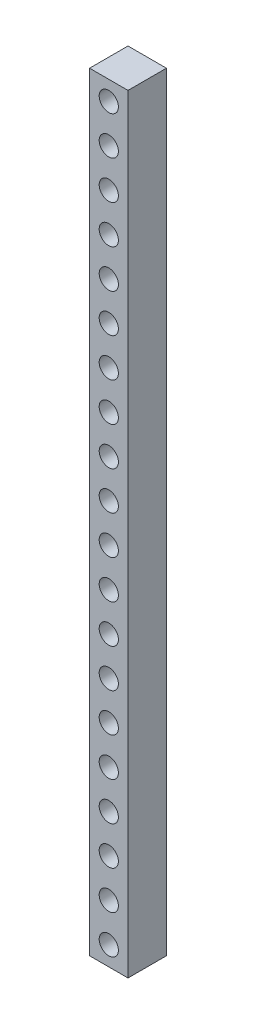
ISO-10303-21;
HEADER;
FILE_DESCRIPTION(('STEP AP214'),'2;1');
FILE_NAME('part.step','',(''),(''),'','','');
FILE_SCHEMA(('AUTOMOTIVE_DESIGN { 1 0 10303 214 1 1 1 1 }'));
ENDSEC;
DATA;
#1=APPLICATION_CONTEXT('core data for automotive mechanical design processes');
#2=APPLICATION_PROTOCOL_DEFINITION('international standard','automotive_design',2000,#1);
#3=PRODUCT_CONTEXT('',#1,'mechanical');
#4=PRODUCT('Part','Part','',(#3));
#5=PRODUCT_RELATED_PRODUCT_CATEGORY('part','',(#4));
#6=PRODUCT_DEFINITION_FORMATION('','',#4);
#7=PRODUCT_DEFINITION_CONTEXT('part definition',#1,'design');
#8=PRODUCT_DEFINITION('design','',#6,#7);
#9=PRODUCT_DEFINITION_SHAPE('','',#8);
#10=(LENGTH_UNIT() NAMED_UNIT(*) SI_UNIT(.MILLI.,.METRE.));
#11=(NAMED_UNIT(*) PLANE_ANGLE_UNIT() SI_UNIT($,.RADIAN.));
#12=(NAMED_UNIT(*) SI_UNIT($,.STERADIAN.) SOLID_ANGLE_UNIT());
#13=UNCERTAINTY_MEASURE_WITH_UNIT(LENGTH_MEASURE(1.E-05),#10,'distance_accuracy_value','');
#14=(GEOMETRIC_REPRESENTATION_CONTEXT(3) GLOBAL_UNCERTAINTY_ASSIGNED_CONTEXT((#13)) GLOBAL_UNIT_ASSIGNED_CONTEXT((#10,
#11,#12)) REPRESENTATION_CONTEXT('',''));
#15=CARTESIAN_POINT('',(0.,0.,0.));
#16=DIRECTION('',(0.,0.,1.));
#17=DIRECTION('',(1.,0.,0.));
#18=AXIS2_PLACEMENT_3D('',#15,#16,#17);
#19=CARTESIAN_POINT('',(0.,0.,10.));
#20=DIRECTION('',(0.,0.,-1.));
#21=DIRECTION('',(-1.,0.,0.));
#22=AXIS2_PLACEMENT_3D('',#19,#20,#21);
#23=PLANE('',#22);
#24=DIRECTION('',(0.,-1.,0.));
#25=VECTOR('',#24,1.);
#26=CARTESIAN_POINT('',(-5.00000000000001,100.,10.));
#27=LINE('',#26,#25);
#28=CARTESIAN_POINT('',(-5.00000000000001,100.,10.));
#29=VERTEX_POINT('',#28);
#30=CARTESIAN_POINT('',(-4.99999999999998,-100.,10.));
#31=VERTEX_POINT('',#30);
#32=EDGE_CURVE('E86',#29,#31,#27,.T.);
#33=ORIENTED_EDGE('',*,*,#32,.T.);
#34=DIRECTION('',(1.,0.,0.));
#35=VECTOR('',#34,1.);
#36=CARTESIAN_POINT('',(5.00000000000001,-100.,10.));
#37=LINE('',#36,#35);
#38=CARTESIAN_POINT('',(5.00000000000001,-100.,10.));
#39=VERTEX_POINT('',#38);
#40=EDGE_CURVE('E81',#31,#39,#37,.T.);
#41=ORIENTED_EDGE('',*,*,#40,.T.);
#42=DIRECTION('',(0.,1.,0.));
#43=VECTOR('',#42,1.);
#44=CARTESIAN_POINT('',(4.99999999999998,99.9999999999999,10.));
#45=LINE('',#44,#43);
#46=CARTESIAN_POINT('',(4.99999999999998,99.9999999999999,10.));
#47=VERTEX_POINT('',#46);
#48=EDGE_CURVE('E84',#39,#47,#45,.T.);
#49=ORIENTED_EDGE('',*,*,#48,.T.);
#50=DIRECTION('',(-1.,0.,0.));
#51=VECTOR('',#50,1.);
#52=CARTESIAN_POINT('',(4.99999999999998,99.9999999999999,10.));
#53=LINE('',#52,#51);
#54=EDGE_CURVE('E51',#47,#29,#53,.T.);
#55=ORIENTED_EDGE('',*,*,#54,.T.);
#56=EDGE_LOOP('',(#33,#41,#49,#55));
#57=FACE_BOUND('',#56,.T.);
#58=CARTESIAN_POINT('',(0.,95.,10.));
#59=DIRECTION('',(0.,0.,1.));
#60=DIRECTION('',(1.,0.,0.));
#61=AXIS2_PLACEMENT_3D('',#58,#59,#60);
#62=CIRCLE('',#61,2.5);
#63=CARTESIAN_POINT('',(2.5,95.,10.));
#64=VERTEX_POINT('',#63);
#65=EDGE_CURVE('E101',#64,#64,#62,.T.);
#66=ORIENTED_EDGE('',*,*,#65,.F.);
#67=EDGE_LOOP('',(#66));
#68=FACE_BOUND('',#67,.T.);
#69=CARTESIAN_POINT('',(1.78152284454799E-12,-75.,10.));
#70=DIRECTION('',(0.,0.,1.));
#71=DIRECTION('',(1.,0.,0.));
#72=AXIS2_PLACEMENT_3D('',#69,#70,#71);
#73=CIRCLE('',#72,2.5);
#74=CARTESIAN_POINT('',(2.50000000000178,-75.,10.));
#75=VERTEX_POINT('',#74);
#76=EDGE_CURVE('E116',#75,#75,#73,.T.);
#77=ORIENTED_EDGE('',*,*,#76,.F.);
#78=EDGE_LOOP('',(#77));
#79=FACE_BOUND('',#78,.T.);
#80=CARTESIAN_POINT('',(1.05611801903282E-13,85.,10.));
#81=DIRECTION('',(0.,0.,1.));
#82=DIRECTION('',(1.,0.,0.));
#83=AXIS2_PLACEMENT_3D('',#80,#81,#82);
#84=CIRCLE('',#83,2.5);
#85=CARTESIAN_POINT('',(2.50000000000011,85.,10.));
#86=VERTEX_POINT('',#85);
#87=EDGE_CURVE('E122',#86,#86,#84,.T.);
#88=ORIENTED_EDGE('',*,*,#87,.F.);
#89=EDGE_LOOP('',(#88));
#90=FACE_BOUND('',#89,.T.);
#91=CARTESIAN_POINT('',(2.10356242068576E-13,75.,10.));
#92=DIRECTION('',(0.,0.,1.));
#93=DIRECTION('',(1.,0.,0.));
#94=AXIS2_PLACEMENT_3D('',#91,#92,#93);
#95=CIRCLE('',#94,2.5);
#96=CARTESIAN_POINT('',(2.50000000000021,75.,10.));
#97=VERTEX_POINT('',#96);
#98=EDGE_CURVE('E128',#97,#97,#95,.T.);
#99=ORIENTED_EDGE('',*,*,#98,.F.);
#100=EDGE_LOOP('',(#99));
#101=FACE_BOUND('',#100,.T.);
#102=CARTESIAN_POINT('',(3.1510068223387E-13,65.,10.));
#103=DIRECTION('',(0.,0.,1.));
#104=DIRECTION('',(1.,0.,0.));
#105=AXIS2_PLACEMENT_3D('',#102,#103,#104);
#106=CIRCLE('',#105,2.5);
#107=CARTESIAN_POINT('',(2.50000000000032,65.,10.));
#108=VERTEX_POINT('',#107);
#109=EDGE_CURVE('E134',#108,#108,#106,.T.);
#110=ORIENTED_EDGE('',*,*,#109,.F.);
#111=EDGE_LOOP('',(#110));
#112=FACE_BOUND('',#111,.T.);
#113=CARTESIAN_POINT('',(4.19845122399164E-13,55.,10.));
#114=DIRECTION('',(0.,0.,1.));
#115=DIRECTION('',(1.,0.,0.));
#116=AXIS2_PLACEMENT_3D('',#113,#114,#115);
#117=CIRCLE('',#116,2.5);
#118=CARTESIAN_POINT('',(2.50000000000042,55.,10.));
#119=VERTEX_POINT('',#118);
#120=EDGE_CURVE('E140',#119,#119,#117,.T.);
#121=ORIENTED_EDGE('',*,*,#120,.F.);
#122=EDGE_LOOP('',(#121));
#123=FACE_BOUND('',#122,.T.);
#124=CARTESIAN_POINT('',(5.24589562564458E-13,45.,10.));
#125=DIRECTION('',(0.,0.,1.));
#126=DIRECTION('',(1.,0.,0.));
#127=AXIS2_PLACEMENT_3D('',#124,#125,#126);
#128=CIRCLE('',#127,2.5);
#129=CARTESIAN_POINT('',(2.50000000000053,45.,10.));
#130=VERTEX_POINT('',#129);
#131=EDGE_CURVE('E146',#130,#130,#128,.T.);
#132=ORIENTED_EDGE('',*,*,#131,.F.);
#133=EDGE_LOOP('',(#132));
#134=FACE_BOUND('',#133,.T.);
#135=CARTESIAN_POINT('',(6.29334002729752E-13,35.,10.));
#136=DIRECTION('',(0.,0.,1.));
#137=DIRECTION('',(1.,0.,0.));
#138=AXIS2_PLACEMENT_3D('',#135,#136,#137);
#139=CIRCLE('',#138,2.5);
#140=CARTESIAN_POINT('',(2.50000000000063,35.,10.));
#141=VERTEX_POINT('',#140);
#142=EDGE_CURVE('E152',#141,#141,#139,.T.);
#143=ORIENTED_EDGE('',*,*,#142,.F.);
#144=EDGE_LOOP('',(#143));
#145=FACE_BOUND('',#144,.T.);
#146=CARTESIAN_POINT('',(7.34078442895046E-13,25.,10.));
#147=DIRECTION('',(0.,0.,1.));
#148=DIRECTION('',(1.,0.,0.));
#149=AXIS2_PLACEMENT_3D('',#146,#147,#148);
#150=CIRCLE('',#149,2.5);
#151=CARTESIAN_POINT('',(2.50000000000073,25.,10.));
#152=VERTEX_POINT('',#151);
#153=EDGE_CURVE('E158',#152,#152,#150,.T.);
#154=ORIENTED_EDGE('',*,*,#153,.F.);
#155=EDGE_LOOP('',(#154));
#156=FACE_BOUND('',#155,.T.);
#157=CARTESIAN_POINT('',(8.3882288306034E-13,15.,10.));
#158=DIRECTION('',(0.,0.,1.));
#159=DIRECTION('',(1.,0.,0.));
#160=AXIS2_PLACEMENT_3D('',#157,#158,#159);
#161=CIRCLE('',#160,2.5);
#162=CARTESIAN_POINT('',(2.50000000000084,15.,10.));
#163=VERTEX_POINT('',#162);
#164=EDGE_CURVE('E164',#163,#163,#161,.T.);
#165=ORIENTED_EDGE('',*,*,#164,.F.);
#166=EDGE_LOOP('',(#165));
#167=FACE_BOUND('',#166,.T.);
#168=CARTESIAN_POINT('',(9.43567323225634E-13,4.99999999999996,10.));
#169=DIRECTION('',(0.,0.,1.));
#170=DIRECTION('',(1.,0.,0.));
#171=AXIS2_PLACEMENT_3D('',#168,#169,#170);
#172=CIRCLE('',#171,2.5);
#173=CARTESIAN_POINT('',(2.50000000000094,4.99999999999996,10.));
#174=VERTEX_POINT('',#173);
#175=EDGE_CURVE('E170',#174,#174,#172,.T.);
#176=ORIENTED_EDGE('',*,*,#175,.F.);
#177=EDGE_LOOP('',(#176));
#178=FACE_BOUND('',#177,.T.);
#179=CARTESIAN_POINT('',(1.04831176339093E-12,-5.00000000000005,10.));
#180=DIRECTION('',(0.,0.,1.));
#181=DIRECTION('',(1.,0.,0.));
#182=AXIS2_PLACEMENT_3D('',#179,#180,#181);
#183=CIRCLE('',#182,2.5);
#184=CARTESIAN_POINT('',(2.50000000000105,-5.00000000000005,10.));
#185=VERTEX_POINT('',#184);
#186=EDGE_CURVE('E176',#185,#185,#183,.T.);
#187=ORIENTED_EDGE('',*,*,#186,.F.);
#188=EDGE_LOOP('',(#187));
#189=FACE_BOUND('',#188,.T.);
#190=CARTESIAN_POINT('',(1.15305620355622E-12,-15.,10.));
#191=DIRECTION('',(0.,0.,1.));
#192=DIRECTION('',(1.,0.,0.));
#193=AXIS2_PLACEMENT_3D('',#190,#191,#192);
#194=CIRCLE('',#193,2.5);
#195=CARTESIAN_POINT('',(2.50000000000115,-15.,10.));
#196=VERTEX_POINT('',#195);
#197=EDGE_CURVE('E182',#196,#196,#194,.T.);
#198=ORIENTED_EDGE('',*,*,#197,.F.);
#199=EDGE_LOOP('',(#198));
#200=FACE_BOUND('',#199,.T.);
#201=CARTESIAN_POINT('',(1.25780064372152E-12,-25.,10.));
#202=DIRECTION('',(0.,0.,1.));
#203=DIRECTION('',(1.,0.,0.));
#204=AXIS2_PLACEMENT_3D('',#201,#202,#203);
#205=CIRCLE('',#204,2.5);
#206=CARTESIAN_POINT('',(2.50000000000126,-25.,10.));
#207=VERTEX_POINT('',#206);
#208=EDGE_CURVE('E188',#207,#207,#205,.T.);
#209=ORIENTED_EDGE('',*,*,#208,.F.);
#210=EDGE_LOOP('',(#209));
#211=FACE_BOUND('',#210,.T.);
#212=CARTESIAN_POINT('',(1.36254508388681E-12,-35.,10.));
#213=DIRECTION('',(0.,0.,1.));
#214=DIRECTION('',(1.,0.,0.));
#215=AXIS2_PLACEMENT_3D('',#212,#213,#214);
#216=CIRCLE('',#215,2.5);
#217=CARTESIAN_POINT('',(2.50000000000136,-35.,10.));
#218=VERTEX_POINT('',#217);
#219=EDGE_CURVE('E194',#218,#218,#216,.T.);
#220=ORIENTED_EDGE('',*,*,#219,.F.);
#221=EDGE_LOOP('',(#220));
#222=FACE_BOUND('',#221,.T.);
#223=CARTESIAN_POINT('',(1.4672895240521E-12,-45.0000000000001,10.));
#224=DIRECTION('',(0.,0.,1.));
#225=DIRECTION('',(1.,0.,0.));
#226=AXIS2_PLACEMENT_3D('',#223,#224,#225);
#227=CIRCLE('',#226,2.5);
#228=CARTESIAN_POINT('',(2.50000000000147,-45.0000000000001,10.));
#229=VERTEX_POINT('',#228);
#230=EDGE_CURVE('E200',#229,#229,#227,.T.);
#231=ORIENTED_EDGE('',*,*,#230,.F.);
#232=EDGE_LOOP('',(#231));
#233=FACE_BOUND('',#232,.T.);
#234=CARTESIAN_POINT('',(1.5720339642174E-12,-55.,10.));
#235=DIRECTION('',(0.,0.,1.));
#236=DIRECTION('',(1.,0.,0.));
#237=AXIS2_PLACEMENT_3D('',#234,#235,#236);
#238=CIRCLE('',#237,2.5);
#239=CARTESIAN_POINT('',(2.50000000000157,-55.,10.));
#240=VERTEX_POINT('',#239);
#241=EDGE_CURVE('E206',#240,#240,#238,.T.);
#242=ORIENTED_EDGE('',*,*,#241,.F.);
#243=EDGE_LOOP('',(#242));
#244=FACE_BOUND('',#243,.T.);
#245=CARTESIAN_POINT('',(1.67677840438269E-12,-65.,10.));
#246=DIRECTION('',(0.,0.,1.));
#247=DIRECTION('',(1.,0.,0.));
#248=AXIS2_PLACEMENT_3D('',#245,#246,#247);
#249=CIRCLE('',#248,2.5);
#250=CARTESIAN_POINT('',(2.50000000000168,-65.,10.));
#251=VERTEX_POINT('',#250);
#252=EDGE_CURVE('E212',#251,#251,#249,.T.);
#253=ORIENTED_EDGE('',*,*,#252,.F.);
#254=EDGE_LOOP('',(#253));
#255=FACE_BOUND('',#254,.T.);
#256=CARTESIAN_POINT('',(1.88626728471328E-12,-85.,10.));
#257=DIRECTION('',(0.,0.,1.));
#258=DIRECTION('',(1.,0.,0.));
#259=AXIS2_PLACEMENT_3D('',#256,#257,#258);
#260=CIRCLE('',#259,2.5);
#261=CARTESIAN_POINT('',(2.50000000000189,-85.,10.));
#262=VERTEX_POINT('',#261);
#263=EDGE_CURVE('E218',#262,#262,#260,.T.);
#264=ORIENTED_EDGE('',*,*,#263,.F.);
#265=EDGE_LOOP('',(#264));
#266=FACE_BOUND('',#265,.T.);
#267=CARTESIAN_POINT('',(1.99101172487857E-12,-94.9999999999999,10.));
#268=DIRECTION('',(0.,0.,1.));
#269=DIRECTION('',(1.,0.,0.));
#270=AXIS2_PLACEMENT_3D('',#267,#268,#269);
#271=CIRCLE('',#270,2.5);
#272=CARTESIAN_POINT('',(2.50000000000199,-94.9999999999999,10.));
#273=VERTEX_POINT('',#272);
#274=EDGE_CURVE('E224',#273,#273,#271,.T.);
#275=ORIENTED_EDGE('',*,*,#274,.F.);
#276=EDGE_LOOP('',(#275));
#277=FACE_BOUND('',#276,.T.);
#278=ADVANCED_FACE('F34',(#57,#68,#79,#90,#101,#112,#123,#134,#145,#156,#167,#178,#189,#200,
#211,#222,#233,#244,#255,#266,#277),#23,.F.);
#279=CARTESIAN_POINT('',(0.,0.,0.));
#280=DIRECTION('',(0.,0.,-1.));
#281=DIRECTION('',(-1.,0.,0.));
#282=AXIS2_PLACEMENT_3D('',#279,#280,#281);
#283=PLANE('',#282);
#284=CARTESIAN_POINT('',(1.88626728471328E-12,-85.,0.));
#285=DIRECTION('',(0.,0.,1.));
#286=DIRECTION('',(1.,0.,0.));
#287=AXIS2_PLACEMENT_3D('',#284,#285,#286);
#288=CIRCLE('',#287,2.5);
#289=CARTESIAN_POINT('',(2.50000000000189,-85.,0.));
#290=VERTEX_POINT('',#289);
#291=EDGE_CURVE('E221',#290,#290,#288,.T.);
#292=ORIENTED_EDGE('',*,*,#291,.T.);
#293=EDGE_LOOP('',(#292));
#294=FACE_BOUND('',#293,.T.);
#295=CARTESIAN_POINT('',(1.5720339642174E-12,-55.,0.));
#296=DIRECTION('',(0.,0.,1.));
#297=DIRECTION('',(1.,0.,0.));
#298=AXIS2_PLACEMENT_3D('',#295,#296,#297);
#299=CIRCLE('',#298,2.5);
#300=CARTESIAN_POINT('',(2.50000000000157,-55.,0.));
#301=VERTEX_POINT('',#300);
#302=EDGE_CURVE('E209',#301,#301,#299,.T.);
#303=ORIENTED_EDGE('',*,*,#302,.T.);
#304=EDGE_LOOP('',(#303));
#305=FACE_BOUND('',#304,.T.);
#306=CARTESIAN_POINT('',(1.36254508388681E-12,-35.,0.));
#307=DIRECTION('',(0.,0.,1.));
#308=DIRECTION('',(1.,0.,0.));
#309=AXIS2_PLACEMENT_3D('',#306,#307,#308);
#310=CIRCLE('',#309,2.5);
#311=CARTESIAN_POINT('',(2.50000000000136,-35.,0.));
#312=VERTEX_POINT('',#311);
#313=EDGE_CURVE('E197',#312,#312,#310,.T.);
#314=ORIENTED_EDGE('',*,*,#313,.T.);
#315=EDGE_LOOP('',(#314));
#316=FACE_BOUND('',#315,.T.);
#317=CARTESIAN_POINT('',(1.15305620355622E-12,-15.,0.));
#318=DIRECTION('',(0.,0.,1.));
#319=DIRECTION('',(1.,0.,0.));
#320=AXIS2_PLACEMENT_3D('',#317,#318,#319);
#321=CIRCLE('',#320,2.5);
#322=CARTESIAN_POINT('',(2.50000000000115,-15.,0.));
#323=VERTEX_POINT('',#322);
#324=EDGE_CURVE('E185',#323,#323,#321,.T.);
#325=ORIENTED_EDGE('',*,*,#324,.T.);
#326=EDGE_LOOP('',(#325));
#327=FACE_BOUND('',#326,.T.);
#328=CARTESIAN_POINT('',(9.43567323225634E-13,4.99999999999996,0.));
#329=DIRECTION('',(0.,0.,1.));
#330=DIRECTION('',(1.,0.,0.));
#331=AXIS2_PLACEMENT_3D('',#328,#329,#330);
#332=CIRCLE('',#331,2.5);
#333=CARTESIAN_POINT('',(2.50000000000094,4.99999999999996,0.));
#334=VERTEX_POINT('',#333);
#335=EDGE_CURVE('E173',#334,#334,#332,.T.);
#336=ORIENTED_EDGE('',*,*,#335,.T.);
#337=EDGE_LOOP('',(#336));
#338=FACE_BOUND('',#337,.T.);
#339=CARTESIAN_POINT('',(7.34078442895046E-13,25.,0.));
#340=DIRECTION('',(0.,0.,1.));
#341=DIRECTION('',(1.,0.,0.));
#342=AXIS2_PLACEMENT_3D('',#339,#340,#341);
#343=CIRCLE('',#342,2.5);
#344=CARTESIAN_POINT('',(2.50000000000073,25.,0.));
#345=VERTEX_POINT('',#344);
#346=EDGE_CURVE('E161',#345,#345,#343,.T.);
#347=ORIENTED_EDGE('',*,*,#346,.T.);
#348=EDGE_LOOP('',(#347));
#349=FACE_BOUND('',#348,.T.);
#350=CARTESIAN_POINT('',(5.24589562564458E-13,45.,0.));
#351=DIRECTION('',(0.,0.,1.));
#352=DIRECTION('',(1.,0.,0.));
#353=AXIS2_PLACEMENT_3D('',#350,#351,#352);
#354=CIRCLE('',#353,2.5);
#355=CARTESIAN_POINT('',(2.50000000000053,45.,0.));
#356=VERTEX_POINT('',#355);
#357=EDGE_CURVE('E149',#356,#356,#354,.T.);
#358=ORIENTED_EDGE('',*,*,#357,.T.);
#359=EDGE_LOOP('',(#358));
#360=FACE_BOUND('',#359,.T.);
#361=CARTESIAN_POINT('',(3.1510068223387E-13,65.,0.));
#362=DIRECTION('',(0.,0.,1.));
#363=DIRECTION('',(1.,0.,0.));
#364=AXIS2_PLACEMENT_3D('',#361,#362,#363);
#365=CIRCLE('',#364,2.5);
#366=CARTESIAN_POINT('',(2.50000000000032,65.,0.));
#367=VERTEX_POINT('',#366);
#368=EDGE_CURVE('E137',#367,#367,#365,.T.);
#369=ORIENTED_EDGE('',*,*,#368,.T.);
#370=EDGE_LOOP('',(#369));
#371=FACE_BOUND('',#370,.T.);
#372=CARTESIAN_POINT('',(1.05611801903282E-13,85.,0.));
#373=DIRECTION('',(0.,0.,1.));
#374=DIRECTION('',(1.,0.,0.));
#375=AXIS2_PLACEMENT_3D('',#372,#373,#374);
#376=CIRCLE('',#375,2.5);
#377=CARTESIAN_POINT('',(2.50000000000011,85.,0.));
#378=VERTEX_POINT('',#377);
#379=EDGE_CURVE('E125',#378,#378,#376,.T.);
#380=ORIENTED_EDGE('',*,*,#379,.T.);
#381=EDGE_LOOP('',(#380));
#382=FACE_BOUND('',#381,.T.);
#383=CARTESIAN_POINT('',(0.,95.,0.));
#384=DIRECTION('',(0.,0.,1.));
#385=DIRECTION('',(1.,0.,0.));
#386=AXIS2_PLACEMENT_3D('',#383,#384,#385);
#387=CIRCLE('',#386,2.5);
#388=CARTESIAN_POINT('',(2.5,95.,0.));
#389=VERTEX_POINT('',#388);
#390=EDGE_CURVE('E113',#389,#389,#387,.T.);
#391=ORIENTED_EDGE('',*,*,#390,.T.);
#392=EDGE_LOOP('',(#391));
#393=FACE_BOUND('',#392,.T.);
#394=DIRECTION('',(0.,-1.,0.));
#395=VECTOR('',#394,1.);
#396=CARTESIAN_POINT('',(-5.00000000000001,100.,0.));
#397=LINE('',#396,#395);
#398=CARTESIAN_POINT('',(-5.00000000000001,100.,0.));
#399=VERTEX_POINT('',#398);
#400=CARTESIAN_POINT('',(-4.99999999999998,-100.,0.));
#401=VERTEX_POINT('',#400);
#402=EDGE_CURVE('E98',#399,#401,#397,.T.);
#403=ORIENTED_EDGE('',*,*,#402,.F.);
#404=DIRECTION('',(-1.,0.,0.));
#405=VECTOR('',#404,1.);
#406=CARTESIAN_POINT('',(4.99999999999998,99.9999999999999,0.));
#407=LINE('',#406,#405);
#408=CARTESIAN_POINT('',(4.99999999999998,99.9999999999999,0.));
#409=VERTEX_POINT('',#408);
#410=EDGE_CURVE('E74',#409,#399,#407,.T.);
#411=ORIENTED_EDGE('',*,*,#410,.F.);
#412=DIRECTION('',(0.,1.,0.));
#413=VECTOR('',#412,1.);
#414=CARTESIAN_POINT('',(4.99999999999998,99.9999999999999,0.));
#415=LINE('',#414,#413);
#416=CARTESIAN_POINT('',(5.00000000000001,-100.,0.));
#417=VERTEX_POINT('',#416);
#418=EDGE_CURVE('E68',#417,#409,#415,.T.);
#419=ORIENTED_EDGE('',*,*,#418,.F.);
#420=DIRECTION('',(1.,0.,0.));
#421=VECTOR('',#420,1.);
#422=CARTESIAN_POINT('',(5.00000000000001,-100.,0.));
#423=LINE('',#422,#421);
#424=EDGE_CURVE('E90',#401,#417,#423,.T.);
#425=ORIENTED_EDGE('',*,*,#424,.F.);
#426=EDGE_LOOP('',(#403,#411,#419,#425));
#427=FACE_BOUND('',#426,.T.);
#428=CARTESIAN_POINT('',(1.78152284454799E-12,-75.,0.));
#429=DIRECTION('',(0.,0.,1.));
#430=DIRECTION('',(1.,0.,0.));
#431=AXIS2_PLACEMENT_3D('',#428,#429,#430);
#432=CIRCLE('',#431,2.5);
#433=CARTESIAN_POINT('',(2.50000000000178,-75.,0.));
#434=VERTEX_POINT('',#433);
#435=EDGE_CURVE('E119',#434,#434,#432,.T.);
#436=ORIENTED_EDGE('',*,*,#435,.T.);
#437=EDGE_LOOP('',(#436));
#438=FACE_BOUND('',#437,.T.);
#439=CARTESIAN_POINT('',(2.10356242068576E-13,75.,0.));
#440=DIRECTION('',(0.,0.,1.));
#441=DIRECTION('',(1.,0.,0.));
#442=AXIS2_PLACEMENT_3D('',#439,#440,#441);
#443=CIRCLE('',#442,2.5);
#444=CARTESIAN_POINT('',(2.50000000000021,75.,0.));
#445=VERTEX_POINT('',#444);
#446=EDGE_CURVE('E131',#445,#445,#443,.T.);
#447=ORIENTED_EDGE('',*,*,#446,.T.);
#448=EDGE_LOOP('',(#447));
#449=FACE_BOUND('',#448,.T.);
#450=CARTESIAN_POINT('',(4.19845122399164E-13,55.,0.));
#451=DIRECTION('',(0.,0.,1.));
#452=DIRECTION('',(1.,0.,0.));
#453=AXIS2_PLACEMENT_3D('',#450,#451,#452);
#454=CIRCLE('',#453,2.5);
#455=CARTESIAN_POINT('',(2.50000000000042,55.,0.));
#456=VERTEX_POINT('',#455);
#457=EDGE_CURVE('E143',#456,#456,#454,.T.);
#458=ORIENTED_EDGE('',*,*,#457,.T.);
#459=EDGE_LOOP('',(#458));
#460=FACE_BOUND('',#459,.T.);
#461=CARTESIAN_POINT('',(6.29334002729752E-13,35.,0.));
#462=DIRECTION('',(0.,0.,1.));
#463=DIRECTION('',(1.,0.,0.));
#464=AXIS2_PLACEMENT_3D('',#461,#462,#463);
#465=CIRCLE('',#464,2.5);
#466=CARTESIAN_POINT('',(2.50000000000063,35.,0.));
#467=VERTEX_POINT('',#466);
#468=EDGE_CURVE('E155',#467,#467,#465,.T.);
#469=ORIENTED_EDGE('',*,*,#468,.T.);
#470=EDGE_LOOP('',(#469));
#471=FACE_BOUND('',#470,.T.);
#472=CARTESIAN_POINT('',(8.3882288306034E-13,15.,0.));
#473=DIRECTION('',(0.,0.,1.));
#474=DIRECTION('',(1.,0.,0.));
#475=AXIS2_PLACEMENT_3D('',#472,#473,#474);
#476=CIRCLE('',#475,2.5);
#477=CARTESIAN_POINT('',(2.50000000000084,15.,0.));
#478=VERTEX_POINT('',#477);
#479=EDGE_CURVE('E167',#478,#478,#476,.T.);
#480=ORIENTED_EDGE('',*,*,#479,.T.);
#481=EDGE_LOOP('',(#480));
#482=FACE_BOUND('',#481,.T.);
#483=CARTESIAN_POINT('',(1.04831176339093E-12,-5.00000000000005,0.));
#484=DIRECTION('',(0.,0.,1.));
#485=DIRECTION('',(1.,0.,0.));
#486=AXIS2_PLACEMENT_3D('',#483,#484,#485);
#487=CIRCLE('',#486,2.5);
#488=CARTESIAN_POINT('',(2.50000000000105,-5.00000000000005,0.));
#489=VERTEX_POINT('',#488);
#490=EDGE_CURVE('E179',#489,#489,#487,.T.);
#491=ORIENTED_EDGE('',*,*,#490,.T.);
#492=EDGE_LOOP('',(#491));
#493=FACE_BOUND('',#492,.T.);
#494=CARTESIAN_POINT('',(1.25780064372152E-12,-25.,0.));
#495=DIRECTION('',(0.,0.,1.));
#496=DIRECTION('',(1.,0.,0.));
#497=AXIS2_PLACEMENT_3D('',#494,#495,#496);
#498=CIRCLE('',#497,2.5);
#499=CARTESIAN_POINT('',(2.50000000000126,-25.,0.));
#500=VERTEX_POINT('',#499);
#501=EDGE_CURVE('E191',#500,#500,#498,.T.);
#502=ORIENTED_EDGE('',*,*,#501,.T.);
#503=EDGE_LOOP('',(#502));
#504=FACE_BOUND('',#503,.T.);
#505=CARTESIAN_POINT('',(1.4672895240521E-12,-45.0000000000001,0.));
#506=DIRECTION('',(0.,0.,1.));
#507=DIRECTION('',(1.,0.,0.));
#508=AXIS2_PLACEMENT_3D('',#505,#506,#507);
#509=CIRCLE('',#508,2.5);
#510=CARTESIAN_POINT('',(2.50000000000147,-45.0000000000001,0.));
#511=VERTEX_POINT('',#510);
#512=EDGE_CURVE('E203',#511,#511,#509,.T.);
#513=ORIENTED_EDGE('',*,*,#512,.T.);
#514=EDGE_LOOP('',(#513));
#515=FACE_BOUND('',#514,.T.);
#516=CARTESIAN_POINT('',(1.67677840438269E-12,-65.,0.));
#517=DIRECTION('',(0.,0.,1.));
#518=DIRECTION('',(1.,0.,0.));
#519=AXIS2_PLACEMENT_3D('',#516,#517,#518);
#520=CIRCLE('',#519,2.5);
#521=CARTESIAN_POINT('',(2.50000000000168,-65.,0.));
#522=VERTEX_POINT('',#521);
#523=EDGE_CURVE('E215',#522,#522,#520,.T.);
#524=ORIENTED_EDGE('',*,*,#523,.T.);
#525=EDGE_LOOP('',(#524));
#526=FACE_BOUND('',#525,.T.);
#527=CARTESIAN_POINT('',(1.99101172487857E-12,-94.9999999999999,0.));
#528=DIRECTION('',(0.,0.,1.));
#529=DIRECTION('',(1.,0.,0.));
#530=AXIS2_PLACEMENT_3D('',#527,#528,#529);
#531=CIRCLE('',#530,2.5);
#532=CARTESIAN_POINT('',(2.50000000000199,-94.9999999999999,0.));
#533=VERTEX_POINT('',#532);
#534=EDGE_CURVE('E227',#533,#533,#531,.T.);
#535=ORIENTED_EDGE('',*,*,#534,.T.);
#536=EDGE_LOOP('',(#535));
#537=FACE_BOUND('',#536,.T.);
#538=ADVANCED_FACE('F109',(#294,#305,#316,#327,#338,#349,#360,#371,#382,#393,#427,#438,#449,
#460,#471,#482,#493,#504,#515,#526,#537),#283,.T.);
#539=CARTESIAN_POINT('',(-5.00000000000001,100.,10.));
#540=DIRECTION('',(1.,0.,0.));
#541=DIRECTION('',(0.,1.,0.));
#542=AXIS2_PLACEMENT_3D('',#539,#540,#541);
#543=PLANE('',#542);
#544=ORIENTED_EDGE('',*,*,#402,.T.);
#545=DIRECTION('',(0.,0.,-1.));
#546=VECTOR('',#545,1.);
#547=CARTESIAN_POINT('',(-4.99999999999998,-100.,10.));
#548=LINE('',#547,#546);
#549=EDGE_CURVE('E11',#31,#401,#548,.T.);
#550=ORIENTED_EDGE('',*,*,#549,.F.);
#551=ORIENTED_EDGE('',*,*,#32,.F.);
#552=DIRECTION('',(0.,0.,-1.));
#553=VECTOR('',#552,1.);
#554=CARTESIAN_POINT('',(-5.00000000000001,100.,10.));
#555=LINE('',#554,#553);
#556=EDGE_CURVE('E94',#29,#399,#555,.T.);
#557=ORIENTED_EDGE('',*,*,#556,.T.);
#558=EDGE_LOOP('',(#544,#550,#551,#557));
#559=FACE_BOUND('',#558,.T.);
#560=ADVANCED_FACE('F36',(#559),#543,.F.);
#561=CARTESIAN_POINT('',(5.00000000000001,-100.,10.));
#562=DIRECTION('',(0.,1.,0.));
#563=DIRECTION('',(-1.,0.,0.));
#564=AXIS2_PLACEMENT_3D('',#561,#562,#563);
#565=PLANE('',#564);
#566=ORIENTED_EDGE('',*,*,#424,.T.);
#567=DIRECTION('',(0.,0.,-1.));
#568=VECTOR('',#567,1.);
#569=CARTESIAN_POINT('',(5.00000000000001,-100.,10.));
#570=LINE('',#569,#568);
#571=EDGE_CURVE('E43',#39,#417,#570,.T.);
#572=ORIENTED_EDGE('',*,*,#571,.F.);
#573=ORIENTED_EDGE('',*,*,#40,.F.);
#574=ORIENTED_EDGE('',*,*,#549,.T.);
#575=EDGE_LOOP('',(#566,#572,#573,#574));
#576=FACE_BOUND('',#575,.T.);
#577=ADVANCED_FACE('F89',(#576),#565,.F.);
#578=CARTESIAN_POINT('',(4.99999999999998,99.9999999999999,10.));
#579=DIRECTION('',(-1.,0.,0.));
#580=DIRECTION('',(0.,-1.,0.));
#581=AXIS2_PLACEMENT_3D('',#578,#579,#580);
#582=PLANE('',#581);
#583=ORIENTED_EDGE('',*,*,#418,.T.);
#584=DIRECTION('',(0.,0.,-1.));
#585=VECTOR('',#584,1.);
#586=CARTESIAN_POINT('',(4.99999999999998,99.9999999999999,10.));
#587=LINE('',#586,#585);
#588=EDGE_CURVE('E91',#47,#409,#587,.T.);
#589=ORIENTED_EDGE('',*,*,#588,.F.);
#590=ORIENTED_EDGE('',*,*,#48,.F.);
#591=ORIENTED_EDGE('',*,*,#571,.T.);
#592=EDGE_LOOP('',(#583,#589,#590,#591));
#593=FACE_BOUND('',#592,.T.);
#594=ADVANCED_FACE('F92',(#593),#582,.F.);
#595=CARTESIAN_POINT('',(4.99999999999998,99.9999999999999,10.));
#596=DIRECTION('',(0.,-1.,0.));
#597=DIRECTION('',(1.,0.,0.));
#598=AXIS2_PLACEMENT_3D('',#595,#596,#597);
#599=PLANE('',#598);
#600=ORIENTED_EDGE('',*,*,#410,.T.);
#601=ORIENTED_EDGE('',*,*,#556,.F.);
#602=ORIENTED_EDGE('',*,*,#54,.F.);
#603=ORIENTED_EDGE('',*,*,#588,.T.);
#604=EDGE_LOOP('',(#600,#601,#602,#603));
#605=FACE_BOUND('',#604,.T.);
#606=ADVANCED_FACE('F106',(#605),#599,.F.);
#607=CARTESIAN_POINT('',(0.,95.,10.));
#608=DIRECTION('',(0.,0.,-1.));
#609=DIRECTION('',(-1.,0.,0.));
#610=AXIS2_PLACEMENT_3D('',#607,#608,#609);
#611=CYLINDRICAL_SURFACE('',#610,2.5);
#612=ORIENTED_EDGE('',*,*,#65,.T.);
#613=EDGE_LOOP('',(#612));
#614=FACE_BOUND('',#613,.T.);
#615=ORIENTED_EDGE('',*,*,#390,.F.);
#616=EDGE_LOOP('',(#615));
#617=FACE_BOUND('',#616,.T.);
#618=ADVANCED_FACE('F244',(#614,#617),#611,.F.);
#619=CARTESIAN_POINT('',(1.78152284454799E-12,-75.,10.));
#620=DIRECTION('',(0.,0.,-1.));
#621=DIRECTION('',(-1.,0.,0.));
#622=AXIS2_PLACEMENT_3D('',#619,#620,#621);
#623=CYLINDRICAL_SURFACE('',#622,2.5);
#624=ORIENTED_EDGE('',*,*,#76,.T.);
#625=EDGE_LOOP('',(#624));
#626=FACE_BOUND('',#625,.T.);
#627=ORIENTED_EDGE('',*,*,#435,.F.);
#628=EDGE_LOOP('',(#627));
#629=FACE_BOUND('',#628,.T.);
#630=ADVANCED_FACE('F290',(#626,#629),#623,.F.);
#631=CARTESIAN_POINT('',(1.05611801903282E-13,85.,10.));
#632=DIRECTION('',(0.,0.,-1.));
#633=DIRECTION('',(-1.,0.,0.));
#634=AXIS2_PLACEMENT_3D('',#631,#632,#633);
#635=CYLINDRICAL_SURFACE('',#634,2.5);
#636=ORIENTED_EDGE('',*,*,#87,.T.);
#637=EDGE_LOOP('',(#636));
#638=FACE_BOUND('',#637,.T.);
#639=ORIENTED_EDGE('',*,*,#379,.F.);
#640=EDGE_LOOP('',(#639));
#641=FACE_BOUND('',#640,.T.);
#642=ADVANCED_FACE('F298',(#638,#641),#635,.F.);
#643=CARTESIAN_POINT('',(2.10356242068576E-13,75.,10.));
#644=DIRECTION('',(0.,0.,-1.));
#645=DIRECTION('',(-1.,0.,0.));
#646=AXIS2_PLACEMENT_3D('',#643,#644,#645);
#647=CYLINDRICAL_SURFACE('',#646,2.5);
#648=ORIENTED_EDGE('',*,*,#98,.T.);
#649=EDGE_LOOP('',(#648));
#650=FACE_BOUND('',#649,.T.);
#651=ORIENTED_EDGE('',*,*,#446,.F.);
#652=EDGE_LOOP('',(#651));
#653=FACE_BOUND('',#652,.T.);
#654=ADVANCED_FACE('F306',(#650,#653),#647,.F.);
#655=CARTESIAN_POINT('',(3.1510068223387E-13,65.,10.));
#656=DIRECTION('',(0.,0.,-1.));
#657=DIRECTION('',(-1.,0.,0.));
#658=AXIS2_PLACEMENT_3D('',#655,#656,#657);
#659=CYLINDRICAL_SURFACE('',#658,2.5);
#660=ORIENTED_EDGE('',*,*,#109,.T.);
#661=EDGE_LOOP('',(#660));
#662=FACE_BOUND('',#661,.T.);
#663=ORIENTED_EDGE('',*,*,#368,.F.);
#664=EDGE_LOOP('',(#663));
#665=FACE_BOUND('',#664,.T.);
#666=ADVANCED_FACE('F315',(#662,#665),#659,.F.);
#667=CARTESIAN_POINT('',(4.19845122399164E-13,55.,10.));
#668=DIRECTION('',(0.,0.,-1.));
#669=DIRECTION('',(-1.,0.,0.));
#670=AXIS2_PLACEMENT_3D('',#667,#668,#669);
#671=CYLINDRICAL_SURFACE('',#670,2.5);
#672=ORIENTED_EDGE('',*,*,#120,.T.);
#673=EDGE_LOOP('',(#672));
#674=FACE_BOUND('',#673,.T.);
#675=ORIENTED_EDGE('',*,*,#457,.F.);
#676=EDGE_LOOP('',(#675));
#677=FACE_BOUND('',#676,.T.);
#678=ADVANCED_FACE('F324',(#674,#677),#671,.F.);
#679=CARTESIAN_POINT('',(5.24589562564458E-13,45.,10.));
#680=DIRECTION('',(0.,0.,-1.));
#681=DIRECTION('',(-1.,0.,0.));
#682=AXIS2_PLACEMENT_3D('',#679,#680,#681);
#683=CYLINDRICAL_SURFACE('',#682,2.5);
#684=ORIENTED_EDGE('',*,*,#131,.T.);
#685=EDGE_LOOP('',(#684));
#686=FACE_BOUND('',#685,.T.);
#687=ORIENTED_EDGE('',*,*,#357,.F.);
#688=EDGE_LOOP('',(#687));
#689=FACE_BOUND('',#688,.T.);
#690=ADVANCED_FACE('F333',(#686,#689),#683,.F.);
#691=CARTESIAN_POINT('',(6.29334002729752E-13,35.,10.));
#692=DIRECTION('',(0.,0.,-1.));
#693=DIRECTION('',(-1.,0.,0.));
#694=AXIS2_PLACEMENT_3D('',#691,#692,#693);
#695=CYLINDRICAL_SURFACE('',#694,2.5);
#696=ORIENTED_EDGE('',*,*,#142,.T.);
#697=EDGE_LOOP('',(#696));
#698=FACE_BOUND('',#697,.T.);
#699=ORIENTED_EDGE('',*,*,#468,.F.);
#700=EDGE_LOOP('',(#699));
#701=FACE_BOUND('',#700,.T.);
#702=ADVANCED_FACE('F342',(#698,#701),#695,.F.);
#703=CARTESIAN_POINT('',(7.34078442895046E-13,25.,10.));
#704=DIRECTION('',(0.,0.,-1.));
#705=DIRECTION('',(-1.,0.,0.));
#706=AXIS2_PLACEMENT_3D('',#703,#704,#705);
#707=CYLINDRICAL_SURFACE('',#706,2.5);
#708=ORIENTED_EDGE('',*,*,#153,.T.);
#709=EDGE_LOOP('',(#708));
#710=FACE_BOUND('',#709,.T.);
#711=ORIENTED_EDGE('',*,*,#346,.F.);
#712=EDGE_LOOP('',(#711));
#713=FACE_BOUND('',#712,.T.);
#714=ADVANCED_FACE('F351',(#710,#713),#707,.F.);
#715=CARTESIAN_POINT('',(8.3882288306034E-13,15.,10.));
#716=DIRECTION('',(0.,0.,-1.));
#717=DIRECTION('',(-1.,0.,0.));
#718=AXIS2_PLACEMENT_3D('',#715,#716,#717);
#719=CYLINDRICAL_SURFACE('',#718,2.5);
#720=ORIENTED_EDGE('',*,*,#164,.T.);
#721=EDGE_LOOP('',(#720));
#722=FACE_BOUND('',#721,.T.);
#723=ORIENTED_EDGE('',*,*,#479,.F.);
#724=EDGE_LOOP('',(#723));
#725=FACE_BOUND('',#724,.T.);
#726=ADVANCED_FACE('F360',(#722,#725),#719,.F.);
#727=CARTESIAN_POINT('',(9.43567323225634E-13,4.99999999999996,10.));
#728=DIRECTION('',(0.,0.,-1.));
#729=DIRECTION('',(-1.,0.,0.));
#730=AXIS2_PLACEMENT_3D('',#727,#728,#729);
#731=CYLINDRICAL_SURFACE('',#730,2.5);
#732=ORIENTED_EDGE('',*,*,#175,.T.);
#733=EDGE_LOOP('',(#732));
#734=FACE_BOUND('',#733,.T.);
#735=ORIENTED_EDGE('',*,*,#335,.F.);
#736=EDGE_LOOP('',(#735));
#737=FACE_BOUND('',#736,.T.);
#738=ADVANCED_FACE('F369',(#734,#737),#731,.F.);
#739=CARTESIAN_POINT('',(1.04831176339093E-12,-5.00000000000005,10.));
#740=DIRECTION('',(0.,0.,-1.));
#741=DIRECTION('',(-1.,0.,0.));
#742=AXIS2_PLACEMENT_3D('',#739,#740,#741);
#743=CYLINDRICAL_SURFACE('',#742,2.5);
#744=ORIENTED_EDGE('',*,*,#186,.T.);
#745=EDGE_LOOP('',(#744));
#746=FACE_BOUND('',#745,.T.);
#747=ORIENTED_EDGE('',*,*,#490,.F.);
#748=EDGE_LOOP('',(#747));
#749=FACE_BOUND('',#748,.T.);
#750=ADVANCED_FACE('F378',(#746,#749),#743,.F.);
#751=CARTESIAN_POINT('',(1.15305620355622E-12,-15.,10.));
#752=DIRECTION('',(0.,0.,-1.));
#753=DIRECTION('',(-1.,0.,0.));
#754=AXIS2_PLACEMENT_3D('',#751,#752,#753);
#755=CYLINDRICAL_SURFACE('',#754,2.5);
#756=ORIENTED_EDGE('',*,*,#197,.T.);
#757=EDGE_LOOP('',(#756));
#758=FACE_BOUND('',#757,.T.);
#759=ORIENTED_EDGE('',*,*,#324,.F.);
#760=EDGE_LOOP('',(#759));
#761=FACE_BOUND('',#760,.T.);
#762=ADVANCED_FACE('F387',(#758,#761),#755,.F.);
#763=CARTESIAN_POINT('',(1.25780064372152E-12,-25.,10.));
#764=DIRECTION('',(0.,0.,-1.));
#765=DIRECTION('',(-1.,0.,0.));
#766=AXIS2_PLACEMENT_3D('',#763,#764,#765);
#767=CYLINDRICAL_SURFACE('',#766,2.5);
#768=ORIENTED_EDGE('',*,*,#208,.T.);
#769=EDGE_LOOP('',(#768));
#770=FACE_BOUND('',#769,.T.);
#771=ORIENTED_EDGE('',*,*,#501,.F.);
#772=EDGE_LOOP('',(#771));
#773=FACE_BOUND('',#772,.T.);
#774=ADVANCED_FACE('F396',(#770,#773),#767,.F.);
#775=CARTESIAN_POINT('',(1.36254508388681E-12,-35.,10.));
#776=DIRECTION('',(0.,0.,-1.));
#777=DIRECTION('',(-1.,0.,0.));
#778=AXIS2_PLACEMENT_3D('',#775,#776,#777);
#779=CYLINDRICAL_SURFACE('',#778,2.5);
#780=ORIENTED_EDGE('',*,*,#219,.T.);
#781=EDGE_LOOP('',(#780));
#782=FACE_BOUND('',#781,.T.);
#783=ORIENTED_EDGE('',*,*,#313,.F.);
#784=EDGE_LOOP('',(#783));
#785=FACE_BOUND('',#784,.T.);
#786=ADVANCED_FACE('F405',(#782,#785),#779,.F.);
#787=CARTESIAN_POINT('',(1.4672895240521E-12,-45.0000000000001,10.));
#788=DIRECTION('',(0.,0.,-1.));
#789=DIRECTION('',(-1.,0.,0.));
#790=AXIS2_PLACEMENT_3D('',#787,#788,#789);
#791=CYLINDRICAL_SURFACE('',#790,2.5);
#792=ORIENTED_EDGE('',*,*,#230,.T.);
#793=EDGE_LOOP('',(#792));
#794=FACE_BOUND('',#793,.T.);
#795=ORIENTED_EDGE('',*,*,#512,.F.);
#796=EDGE_LOOP('',(#795));
#797=FACE_BOUND('',#796,.T.);
#798=ADVANCED_FACE('F414',(#794,#797),#791,.F.);
#799=CARTESIAN_POINT('',(1.5720339642174E-12,-55.,10.));
#800=DIRECTION('',(0.,0.,-1.));
#801=DIRECTION('',(-1.,0.,0.));
#802=AXIS2_PLACEMENT_3D('',#799,#800,#801);
#803=CYLINDRICAL_SURFACE('',#802,2.5);
#804=ORIENTED_EDGE('',*,*,#241,.T.);
#805=EDGE_LOOP('',(#804));
#806=FACE_BOUND('',#805,.T.);
#807=ORIENTED_EDGE('',*,*,#302,.F.);
#808=EDGE_LOOP('',(#807));
#809=FACE_BOUND('',#808,.T.);
#810=ADVANCED_FACE('F423',(#806,#809),#803,.F.);
#811=CARTESIAN_POINT('',(1.67677840438269E-12,-65.,10.));
#812=DIRECTION('',(0.,0.,-1.));
#813=DIRECTION('',(-1.,0.,0.));
#814=AXIS2_PLACEMENT_3D('',#811,#812,#813);
#815=CYLINDRICAL_SURFACE('',#814,2.5);
#816=ORIENTED_EDGE('',*,*,#252,.T.);
#817=EDGE_LOOP('',(#816));
#818=FACE_BOUND('',#817,.T.);
#819=ORIENTED_EDGE('',*,*,#523,.F.);
#820=EDGE_LOOP('',(#819));
#821=FACE_BOUND('',#820,.T.);
#822=ADVANCED_FACE('F432',(#818,#821),#815,.F.);
#823=CARTESIAN_POINT('',(1.88626728471328E-12,-85.,10.));
#824=DIRECTION('',(0.,0.,-1.));
#825=DIRECTION('',(-1.,0.,0.));
#826=AXIS2_PLACEMENT_3D('',#823,#824,#825);
#827=CYLINDRICAL_SURFACE('',#826,2.5);
#828=ORIENTED_EDGE('',*,*,#263,.T.);
#829=EDGE_LOOP('',(#828));
#830=FACE_BOUND('',#829,.T.);
#831=ORIENTED_EDGE('',*,*,#291,.F.);
#832=EDGE_LOOP('',(#831));
#833=FACE_BOUND('',#832,.T.);
#834=ADVANCED_FACE('F441',(#830,#833),#827,.F.);
#835=CARTESIAN_POINT('',(1.99101172487857E-12,-94.9999999999999,10.));
#836=DIRECTION('',(0.,0.,-1.));
#837=DIRECTION('',(-1.,0.,0.));
#838=AXIS2_PLACEMENT_3D('',#835,#836,#837);
#839=CYLINDRICAL_SURFACE('',#838,2.5);
#840=ORIENTED_EDGE('',*,*,#274,.T.);
#841=EDGE_LOOP('',(#840));
#842=FACE_BOUND('',#841,.T.);
#843=ORIENTED_EDGE('',*,*,#534,.F.);
#844=EDGE_LOOP('',(#843));
#845=FACE_BOUND('',#844,.T.);
#846=ADVANCED_FACE('F233',(#842,#845),#839,.F.);
#847=CLOSED_SHELL('',(#278,#538,#560,#577,#594,#606,#618,#630,#642,#654,#666,#678,#690,#702,
#714,#726,#738,#750,#762,#774,#786,#798,#810,#822,#834,#846));
#848=MANIFOLD_SOLID_BREP('B2',#847);
#849=ADVANCED_BREP_SHAPE_REPRESENTATION('',(#18,#848),#14);
#850=SHAPE_DEFINITION_REPRESENTATION(#9,#849);
ENDSEC;
END-ISO-10303-21;
